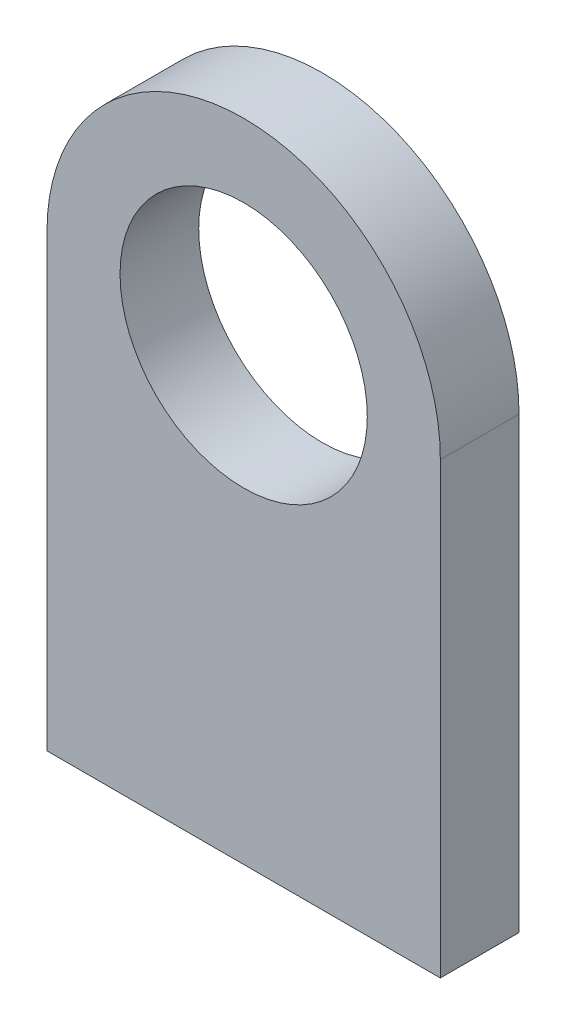
ISO-10303-21;
HEADER;
FILE_DESCRIPTION(('STEP AP214'),'2;1');
FILE_NAME('part.step','',(''),(''),'','','');
FILE_SCHEMA(('AUTOMOTIVE_DESIGN { 1 0 10303 214 1 1 1 1 }'));
ENDSEC;
DATA;
#1=APPLICATION_CONTEXT('core data for automotive mechanical design processes');
#2=APPLICATION_PROTOCOL_DEFINITION('international standard','automotive_design',2000,#1);
#3=PRODUCT_CONTEXT('',#1,'mechanical');
#4=PRODUCT('Part','Part','',(#3));
#5=PRODUCT_RELATED_PRODUCT_CATEGORY('part','',(#4));
#6=PRODUCT_DEFINITION_FORMATION('','',#4);
#7=PRODUCT_DEFINITION_CONTEXT('part definition',#1,'design');
#8=PRODUCT_DEFINITION('design','',#6,#7);
#9=PRODUCT_DEFINITION_SHAPE('','',#8);
#10=(LENGTH_UNIT() NAMED_UNIT(*) SI_UNIT(.MILLI.,.METRE.));
#11=(NAMED_UNIT(*) PLANE_ANGLE_UNIT() SI_UNIT($,.RADIAN.));
#12=(NAMED_UNIT(*) SI_UNIT($,.STERADIAN.) SOLID_ANGLE_UNIT());
#13=UNCERTAINTY_MEASURE_WITH_UNIT(LENGTH_MEASURE(1.E-05),#10,'distance_accuracy_value','');
#14=(GEOMETRIC_REPRESENTATION_CONTEXT(3) GLOBAL_UNCERTAINTY_ASSIGNED_CONTEXT((#13)) GLOBAL_UNIT_ASSIGNED_CONTEXT((#10,
#11,#12)) REPRESENTATION_CONTEXT('',''));
#15=CARTESIAN_POINT('',(0.,0.,0.));
#16=DIRECTION('',(0.,0.,1.));
#17=DIRECTION('',(1.,0.,0.));
#18=AXIS2_PLACEMENT_3D('',#15,#16,#17);
#19=CARTESIAN_POINT('',(-17.5,0.,7.));
#20=DIRECTION('',(-1.,0.,0.));
#21=DIRECTION('',(0.,0.,1.));
#22=AXIS2_PLACEMENT_3D('',#19,#20,#21);
#23=PLANE('',#22);
#24=DIRECTION('',(0.,1.,0.));
#25=VECTOR('',#24,1.);
#26=CARTESIAN_POINT('',(-17.5,0.,0.));
#27=LINE('',#26,#25);
#28=CARTESIAN_POINT('',(-17.5,-40.,0.));
#29=VERTEX_POINT('',#28);
#30=CARTESIAN_POINT('',(-17.5,0.053774100299598,0.));
#31=VERTEX_POINT('',#30);
#32=EDGE_CURVE('E105',#29,#31,#27,.T.);
#33=ORIENTED_EDGE('',*,*,#32,.F.);
#34=DIRECTION('',(0.,0.,-1.));
#35=VECTOR('',#34,1.);
#36=CARTESIAN_POINT('',(-17.5,-40.,7.));
#37=LINE('',#36,#35);
#38=CARTESIAN_POINT('',(-17.5,-40.,7.));
#39=VERTEX_POINT('',#38);
#40=EDGE_CURVE('E11',#39,#29,#37,.T.);
#41=ORIENTED_EDGE('',*,*,#40,.F.);
#42=DIRECTION('',(0.,1.,0.));
#43=VECTOR('',#42,1.);
#44=CARTESIAN_POINT('',(-17.5,0.,7.));
#45=LINE('',#44,#43);
#46=CARTESIAN_POINT('',(-17.5,0.053774100299598,7.));
#47=VERTEX_POINT('',#46);
#48=EDGE_CURVE('E90',#39,#47,#45,.T.);
#49=ORIENTED_EDGE('',*,*,#48,.T.);
#50=DIRECTION('',(0.,0.,-1.));
#51=VECTOR('',#50,1.);
#52=CARTESIAN_POINT('',(-17.5,0.053774100299598,7.));
#53=LINE('',#52,#51);
#54=EDGE_CURVE('E78',#47,#31,#53,.T.);
#55=ORIENTED_EDGE('',*,*,#54,.T.);
#56=EDGE_LOOP('',(#33,#41,#49,#55));
#57=FACE_BOUND('',#56,.T.);
#58=ADVANCED_FACE('F39',(#57),#23,.T.);
#59=CARTESIAN_POINT('',(0.,-40.,7.));
#60=DIRECTION('',(0.,1.,0.));
#61=DIRECTION('',(-1.,0.,0.));
#62=AXIS2_PLACEMENT_3D('',#59,#60,#61);
#63=PLANE('',#62);
#64=DIRECTION('',(1.,0.,0.));
#65=VECTOR('',#64,1.);
#66=CARTESIAN_POINT('',(0.,-40.,0.));
#67=LINE('',#66,#65);
#68=CARTESIAN_POINT('',(17.5,-40.,0.));
#69=VERTEX_POINT('',#68);
#70=EDGE_CURVE('E95',#29,#69,#67,.T.);
#71=ORIENTED_EDGE('',*,*,#70,.T.);
#72=DIRECTION('',(0.,0.,-1.));
#73=VECTOR('',#72,1.);
#74=CARTESIAN_POINT('',(17.5,-40.,7.));
#75=LINE('',#74,#73);
#76=CARTESIAN_POINT('',(17.5,-40.,7.));
#77=VERTEX_POINT('',#76);
#78=EDGE_CURVE('E47',#77,#69,#75,.T.);
#79=ORIENTED_EDGE('',*,*,#78,.F.);
#80=DIRECTION('',(1.,0.,0.));
#81=VECTOR('',#80,1.);
#82=CARTESIAN_POINT('',(0.,-40.,7.));
#83=LINE('',#82,#81);
#84=EDGE_CURVE('E84',#39,#77,#83,.T.);
#85=ORIENTED_EDGE('',*,*,#84,.F.);
#86=ORIENTED_EDGE('',*,*,#40,.T.);
#87=EDGE_LOOP('',(#71,#79,#85,#86));
#88=FACE_BOUND('',#87,.T.);
#89=ADVANCED_FACE('F93',(#88),#63,.F.);
#90=CARTESIAN_POINT('',(17.5,0.,7.));
#91=DIRECTION('',(-1.,0.,0.));
#92=DIRECTION('',(0.,-1.,0.));
#93=AXIS2_PLACEMENT_3D('',#90,#91,#92);
#94=PLANE('',#93);
#95=DIRECTION('',(0.,1.,0.));
#96=VECTOR('',#95,1.);
#97=CARTESIAN_POINT('',(17.5,0.,0.));
#98=LINE('',#97,#96);
#99=CARTESIAN_POINT('',(17.5,-0.0537741002984689,0.));
#100=VERTEX_POINT('',#99);
#101=EDGE_CURVE('E71',#69,#100,#98,.T.);
#102=ORIENTED_EDGE('',*,*,#101,.T.);
#103=DIRECTION('',(0.,0.,-1.));
#104=VECTOR('',#103,1.);
#105=CARTESIAN_POINT('',(17.5,-0.0537741002984689,7.));
#106=LINE('',#105,#104);
#107=CARTESIAN_POINT('',(17.5,-0.0537741002984689,7.));
#108=VERTEX_POINT('',#107);
#109=EDGE_CURVE('E96',#108,#100,#106,.T.);
#110=ORIENTED_EDGE('',*,*,#109,.F.);
#111=DIRECTION('',(0.,1.,0.));
#112=VECTOR('',#111,1.);
#113=CARTESIAN_POINT('',(17.5,0.,7.));
#114=LINE('',#113,#112);
#115=EDGE_CURVE('E89',#77,#108,#114,.T.);
#116=ORIENTED_EDGE('',*,*,#115,.F.);
#117=ORIENTED_EDGE('',*,*,#78,.T.);
#118=EDGE_LOOP('',(#102,#110,#116,#117));
#119=FACE_BOUND('',#118,.T.);
#120=ADVANCED_FACE('F97',(#119),#94,.F.);
#121=CARTESIAN_POINT('',(0.,0.,7.));
#122=DIRECTION('',(0.,0.,-1.));
#123=DIRECTION('',(-1.,0.,0.));
#124=AXIS2_PLACEMENT_3D('',#121,#122,#123);
#125=CYLINDRICAL_SURFACE('',#124,17.5000826184868);
#126=CARTESIAN_POINT('',(0.,0.,0.));
#127=DIRECTION('',(0.,0.,1.));
#128=DIRECTION('',(1.,0.,0.));
#129=AXIS2_PLACEMENT_3D('',#126,#127,#128);
#130=CIRCLE('',#129,17.5000826184868);
#131=EDGE_CURVE('E110',#100,#31,#130,.T.);
#132=ORIENTED_EDGE('',*,*,#131,.T.);
#133=ORIENTED_EDGE('',*,*,#54,.F.);
#134=CARTESIAN_POINT('',(0.,0.,7.));
#135=DIRECTION('',(0.,0.,1.));
#136=DIRECTION('',(1.,0.,0.));
#137=AXIS2_PLACEMENT_3D('',#134,#135,#136);
#138=CIRCLE('',#137,17.5000826184868);
#139=EDGE_CURVE('E55',#108,#47,#138,.T.);
#140=ORIENTED_EDGE('',*,*,#139,.F.);
#141=ORIENTED_EDGE('',*,*,#109,.T.);
#142=EDGE_LOOP('',(#132,#133,#140,#141));
#143=FACE_BOUND('',#142,.T.);
#144=ADVANCED_FACE('F118',(#143),#125,.T.);
#145=CARTESIAN_POINT('',(0.,0.,7.));
#146=DIRECTION('',(0.,0.,-1.));
#147=DIRECTION('',(-1.,0.,0.));
#148=AXIS2_PLACEMENT_3D('',#145,#146,#147);
#149=CYLINDRICAL_SURFACE('',#148,11.);
#150=CARTESIAN_POINT('',(0.,0.,7.));
#151=DIRECTION('',(0.,0.,1.));
#152=DIRECTION('',(1.,0.,0.));
#153=AXIS2_PLACEMENT_3D('',#150,#151,#152);
#154=CIRCLE('',#153,11.);
#155=CARTESIAN_POINT('',(11.,0.,7.));
#156=VERTEX_POINT('',#155);
#157=EDGE_CURVE('E99',#156,#156,#154,.T.);
#158=ORIENTED_EDGE('',*,*,#157,.T.);
#159=EDGE_LOOP('',(#158));
#160=FACE_BOUND('',#159,.T.);
#161=CARTESIAN_POINT('',(0.,0.,0.));
#162=DIRECTION('',(0.,0.,1.));
#163=DIRECTION('',(1.,0.,0.));
#164=AXIS2_PLACEMENT_3D('',#161,#162,#163);
#165=CIRCLE('',#164,11.);
#166=CARTESIAN_POINT('',(11.,0.,0.));
#167=VERTEX_POINT('',#166);
#168=EDGE_CURVE('E112',#167,#167,#165,.T.);
#169=ORIENTED_EDGE('',*,*,#168,.F.);
#170=EDGE_LOOP('',(#169));
#171=FACE_BOUND('',#170,.T.);
#172=ADVANCED_FACE('F133',(#160,#171),#149,.F.);
#173=CARTESIAN_POINT('',(0.,0.,7.));
#174=DIRECTION('',(0.,0.,1.));
#175=DIRECTION('',(1.,0.,0.));
#176=AXIS2_PLACEMENT_3D('',#173,#174,#175);
#177=PLANE('',#176);
#178=ORIENTED_EDGE('',*,*,#48,.F.);
#179=ORIENTED_EDGE('',*,*,#84,.T.);
#180=ORIENTED_EDGE('',*,*,#115,.T.);
#181=ORIENTED_EDGE('',*,*,#139,.T.);
#182=EDGE_LOOP('',(#178,#179,#180,#181));
#183=FACE_BOUND('',#182,.T.);
#184=ORIENTED_EDGE('',*,*,#157,.F.);
#185=EDGE_LOOP('',(#184));
#186=FACE_BOUND('',#185,.T.);
#187=ADVANCED_FACE('F86',(#183,#186),#177,.T.);
#188=CARTESIAN_POINT('',(0.,0.,0.));
#189=DIRECTION('',(0.,0.,1.));
#190=DIRECTION('',(1.,0.,0.));
#191=AXIS2_PLACEMENT_3D('',#188,#189,#190);
#192=PLANE('',#191);
#193=ORIENTED_EDGE('',*,*,#32,.T.);
#194=ORIENTED_EDGE('',*,*,#131,.F.);
#195=ORIENTED_EDGE('',*,*,#101,.F.);
#196=ORIENTED_EDGE('',*,*,#70,.F.);
#197=EDGE_LOOP('',(#193,#194,#195,#196));
#198=FACE_BOUND('',#197,.T.);
#199=ORIENTED_EDGE('',*,*,#168,.T.);
#200=EDGE_LOOP('',(#199));
#201=FACE_BOUND('',#200,.T.);
#202=ADVANCED_FACE('F120',(#198,#201),#192,.F.);
#203=CLOSED_SHELL('',(#58,#89,#120,#144,#172,#187,#202));
#204=MANIFOLD_SOLID_BREP('B2',#203);
#205=ADVANCED_BREP_SHAPE_REPRESENTATION('',(#18,#204),#14);
#206=SHAPE_DEFINITION_REPRESENTATION(#9,#205);
ENDSEC;
END-ISO-10303-21;
